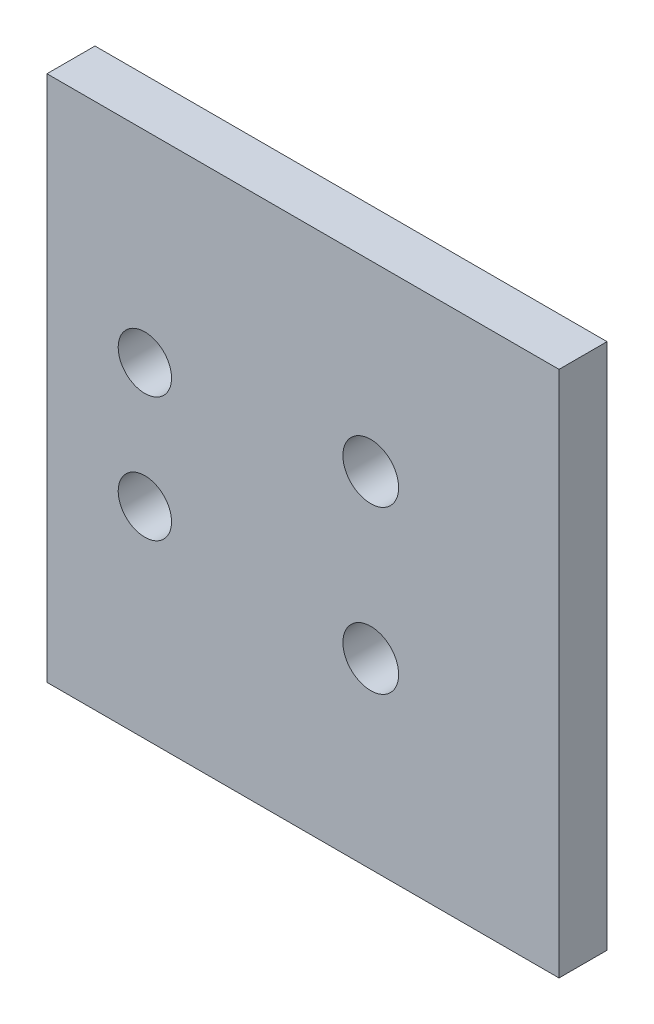
ISO-10303-21;
HEADER;
FILE_DESCRIPTION(('STEP AP214'),'2;1');
FILE_NAME('part.step','',(''),(''),'','','');
FILE_SCHEMA(('AUTOMOTIVE_DESIGN { 1 0 10303 214 1 1 1 1 }'));
ENDSEC;
DATA;
#1=APPLICATION_CONTEXT('core data for automotive mechanical design processes');
#2=APPLICATION_PROTOCOL_DEFINITION('international standard','automotive_design',2000,#1);
#3=PRODUCT_CONTEXT('',#1,'mechanical');
#4=PRODUCT('Part','Part','',(#3));
#5=PRODUCT_RELATED_PRODUCT_CATEGORY('part','',(#4));
#6=PRODUCT_DEFINITION_FORMATION('','',#4);
#7=PRODUCT_DEFINITION_CONTEXT('part definition',#1,'design');
#8=PRODUCT_DEFINITION('design','',#6,#7);
#9=PRODUCT_DEFINITION_SHAPE('','',#8);
#10=(LENGTH_UNIT() NAMED_UNIT(*) SI_UNIT(.MILLI.,.METRE.));
#11=(NAMED_UNIT(*) PLANE_ANGLE_UNIT() SI_UNIT($,.RADIAN.));
#12=(NAMED_UNIT(*) SI_UNIT($,.STERADIAN.) SOLID_ANGLE_UNIT());
#13=UNCERTAINTY_MEASURE_WITH_UNIT(LENGTH_MEASURE(1.E-05),#10,'distance_accuracy_value','');
#14=(GEOMETRIC_REPRESENTATION_CONTEXT(3) GLOBAL_UNCERTAINTY_ASSIGNED_CONTEXT((#13)) GLOBAL_UNIT_ASSIGNED_CONTEXT((#10,
#11,#12)) REPRESENTATION_CONTEXT('',''));
#15=CARTESIAN_POINT('',(0.,0.,0.));
#16=DIRECTION('',(0.,0.,1.));
#17=DIRECTION('',(1.,0.,0.));
#18=AXIS2_PLACEMENT_3D('',#15,#16,#17);
#19=CARTESIAN_POINT('',(88.138,72.39,1.6194024));
#20=DIRECTION('',(1.,0.,0.));
#21=DIRECTION('',(0.,0.,-1.));
#22=AXIS2_PLACEMENT_3D('',#19,#20,#21);
#23=PLANE('',#22);
#24=DIRECTION('',(0.,-1.,0.));
#25=VECTOR('',#24,1.);
#26=CARTESIAN_POINT('',(88.138,72.39,0.));
#27=LINE('',#26,#25);
#28=CARTESIAN_POINT('',(88.138,72.39,0.));
#29=VERTEX_POINT('',#28);
#30=CARTESIAN_POINT('',(88.138,54.61,0.));
#31=VERTEX_POINT('',#30);
#32=EDGE_CURVE('E79',#29,#31,#27,.T.);
#33=ORIENTED_EDGE('',*,*,#32,.T.);
#34=DIRECTION('',(0.,0.,-1.));
#35=VECTOR('',#34,1.);
#36=CARTESIAN_POINT('',(88.138,54.61,1.6194024));
#37=LINE('',#36,#35);
#38=CARTESIAN_POINT('',(88.138,54.61,1.6194024));
#39=VERTEX_POINT('',#38);
#40=EDGE_CURVE('E11',#39,#31,#37,.T.);
#41=ORIENTED_EDGE('',*,*,#40,.F.);
#42=DIRECTION('',(0.,-1.,0.));
#43=VECTOR('',#42,1.);
#44=CARTESIAN_POINT('',(88.138,72.39,1.6194024));
#45=LINE('',#44,#43);
#46=CARTESIAN_POINT('',(88.138,72.39,1.6194024));
#47=VERTEX_POINT('',#46);
#48=EDGE_CURVE('E67',#47,#39,#45,.T.);
#49=ORIENTED_EDGE('',*,*,#48,.F.);
#50=DIRECTION('',(0.,0.,-1.));
#51=VECTOR('',#50,1.);
#52=CARTESIAN_POINT('',(88.138,72.39,1.6194024));
#53=LINE('',#52,#51);
#54=EDGE_CURVE('E75',#47,#29,#53,.T.);
#55=ORIENTED_EDGE('',*,*,#54,.T.);
#56=EDGE_LOOP('',(#33,#41,#49,#55));
#57=FACE_BOUND('',#56,.T.);
#58=ADVANCED_FACE('F16',(#57),#23,.F.);
#59=CARTESIAN_POINT('',(88.138,54.61,1.6194024));
#60=DIRECTION('',(0.,1.,0.));
#61=DIRECTION('',(0.,0.,1.));
#62=AXIS2_PLACEMENT_3D('',#59,#60,#61);
#63=PLANE('',#62);
#64=DIRECTION('',(1.,0.,0.));
#65=VECTOR('',#64,1.);
#66=CARTESIAN_POINT('',(88.138,54.61,0.));
#67=LINE('',#66,#65);
#68=CARTESIAN_POINT('',(105.41,54.61,0.));
#69=VERTEX_POINT('',#68);
#70=EDGE_CURVE('E71',#31,#69,#67,.T.);
#71=ORIENTED_EDGE('',*,*,#70,.T.);
#72=DIRECTION('',(0.,0.,-1.));
#73=VECTOR('',#72,1.);
#74=CARTESIAN_POINT('',(105.41,54.61,1.6194024));
#75=LINE('',#74,#73);
#76=CARTESIAN_POINT('',(105.41,54.61,1.6194024));
#77=VERTEX_POINT('',#76);
#78=EDGE_CURVE('E24',#77,#69,#75,.T.);
#79=ORIENTED_EDGE('',*,*,#78,.F.);
#80=DIRECTION('',(1.,0.,0.));
#81=VECTOR('',#80,1.);
#82=CARTESIAN_POINT('',(88.138,54.61,1.6194024));
#83=LINE('',#82,#81);
#84=EDGE_CURVE('E62',#39,#77,#83,.T.);
#85=ORIENTED_EDGE('',*,*,#84,.F.);
#86=ORIENTED_EDGE('',*,*,#40,.T.);
#87=EDGE_LOOP('',(#71,#79,#85,#86));
#88=FACE_BOUND('',#87,.T.);
#89=ADVANCED_FACE('F70',(#88),#63,.F.);
#90=CARTESIAN_POINT('',(105.41,54.61,1.6194024));
#91=DIRECTION('',(-1.,0.,0.));
#92=DIRECTION('',(0.,0.,1.));
#93=AXIS2_PLACEMENT_3D('',#90,#91,#92);
#94=PLANE('',#93);
#95=DIRECTION('',(0.,1.,0.));
#96=VECTOR('',#95,1.);
#97=CARTESIAN_POINT('',(105.41,54.61,0.));
#98=LINE('',#97,#96);
#99=CARTESIAN_POINT('',(105.41,72.39,0.));
#100=VERTEX_POINT('',#99);
#101=EDGE_CURVE('E49',#69,#100,#98,.T.);
#102=ORIENTED_EDGE('',*,*,#101,.T.);
#103=DIRECTION('',(0.,0.,-1.));
#104=VECTOR('',#103,1.);
#105=CARTESIAN_POINT('',(105.41,72.39,1.6194024));
#106=LINE('',#105,#104);
#107=CARTESIAN_POINT('',(105.41,72.39,1.6194024));
#108=VERTEX_POINT('',#107);
#109=EDGE_CURVE('E72',#108,#100,#106,.T.);
#110=ORIENTED_EDGE('',*,*,#109,.F.);
#111=DIRECTION('',(0.,1.,0.));
#112=VECTOR('',#111,1.);
#113=CARTESIAN_POINT('',(105.41,54.61,1.6194024));
#114=LINE('',#113,#112);
#115=EDGE_CURVE('E65',#77,#108,#114,.T.);
#116=ORIENTED_EDGE('',*,*,#115,.F.);
#117=ORIENTED_EDGE('',*,*,#78,.T.);
#118=EDGE_LOOP('',(#102,#110,#116,#117));
#119=FACE_BOUND('',#118,.T.);
#120=ADVANCED_FACE('F73',(#119),#94,.F.);
#121=CARTESIAN_POINT('',(105.41,72.39,1.6194024));
#122=DIRECTION('',(0.,-1.,0.));
#123=DIRECTION('',(0.,0.,-1.));
#124=AXIS2_PLACEMENT_3D('',#121,#122,#123);
#125=PLANE('',#124);
#126=DIRECTION('',(-1.,0.,0.));
#127=VECTOR('',#126,1.);
#128=CARTESIAN_POINT('',(105.41,72.39,0.));
#129=LINE('',#128,#127);
#130=EDGE_CURVE('E55',#100,#29,#129,.T.);
#131=ORIENTED_EDGE('',*,*,#130,.T.);
#132=ORIENTED_EDGE('',*,*,#54,.F.);
#133=DIRECTION('',(-1.,0.,0.));
#134=VECTOR('',#133,1.);
#135=CARTESIAN_POINT('',(105.41,72.39,1.6194024));
#136=LINE('',#135,#134);
#137=EDGE_CURVE('E32',#108,#47,#136,.T.);
#138=ORIENTED_EDGE('',*,*,#137,.F.);
#139=ORIENTED_EDGE('',*,*,#109,.T.);
#140=EDGE_LOOP('',(#131,#132,#138,#139));
#141=FACE_BOUND('',#140,.T.);
#142=ADVANCED_FACE('F87',(#141),#125,.F.);
#143=CARTESIAN_POINT('',(0.,0.,1.6194024));
#144=DIRECTION('',(0.,0.,1.));
#145=DIRECTION('',(1.,0.,0.));
#146=AXIS2_PLACEMENT_3D('',#143,#144,#145);
#147=PLANE('',#146);
#148=CARTESIAN_POINT('',(91.44,61.39999912,1.6194024));
#149=DIRECTION('',(0.,0.,-1.));
#150=DIRECTION('',(-1.,0.,0.));
#151=AXIS2_PLACEMENT_3D('',#148,#149,#150);
#152=CIRCLE('',#151,0.899999469999982);
#153=CARTESIAN_POINT('',(90.54000053,61.39999912,1.6194024));
#154=VERTEX_POINT('',#153);
#155=EDGE_CURVE('E110',#154,#154,#152,.T.);
#156=ORIENTED_EDGE('',*,*,#155,.T.);
#157=EDGE_LOOP('',(#156));
#158=FACE_BOUND('',#157,.T.);
#159=CARTESIAN_POINT('',(91.44000254,65.59999834,1.6194024));
#160=DIRECTION('',(0.,0.,-1.));
#161=DIRECTION('',(-1.,0.,0.));
#162=AXIS2_PLACEMENT_3D('',#159,#160,#161);
#163=CIRCLE('',#162,0.899999469999982);
#164=CARTESIAN_POINT('',(90.54000307,65.59999834,1.6194024));
#165=VERTEX_POINT('',#164);
#166=EDGE_CURVE('E104',#165,#165,#163,.T.);
#167=ORIENTED_EDGE('',*,*,#166,.T.);
#168=EDGE_LOOP('',(#167));
#169=FACE_BOUND('',#168,.T.);
#170=CARTESIAN_POINT('',(99.06,60.7695,1.6194024));
#171=DIRECTION('',(0.,0.,-1.));
#172=DIRECTION('',(-1.,0.,0.));
#173=AXIS2_PLACEMENT_3D('',#170,#171,#172);
#174=CIRCLE('',#173,0.939999389999988);
#175=CARTESIAN_POINT('',(98.12000061,60.7695,1.6194024));
#176=VERTEX_POINT('',#175);
#177=EDGE_CURVE('E98',#176,#176,#174,.T.);
#178=ORIENTED_EDGE('',*,*,#177,.T.);
#179=EDGE_LOOP('',(#178));
#180=FACE_BOUND('',#179,.T.);
#181=CARTESIAN_POINT('',(99.06,66.2305,1.6194024));
#182=DIRECTION('',(0.,0.,-1.));
#183=DIRECTION('',(-1.,0.,0.));
#184=AXIS2_PLACEMENT_3D('',#181,#182,#183);
#185=CIRCLE('',#184,0.939999389999988);
#186=CARTESIAN_POINT('',(98.12000061,66.2305,1.6194024));
#187=VERTEX_POINT('',#186);
#188=EDGE_CURVE('E82',#187,#187,#185,.T.);
#189=ORIENTED_EDGE('',*,*,#188,.T.);
#190=EDGE_LOOP('',(#189));
#191=FACE_BOUND('',#190,.T.);
#192=ORIENTED_EDGE('',*,*,#48,.T.);
#193=ORIENTED_EDGE('',*,*,#84,.T.);
#194=ORIENTED_EDGE('',*,*,#115,.T.);
#195=ORIENTED_EDGE('',*,*,#137,.T.);
#196=EDGE_LOOP('',(#192,#193,#194,#195));
#197=FACE_BOUND('',#196,.T.);
#198=ADVANCED_FACE('F63',(#158,#169,#180,#191,#197),#147,.T.);
#199=CARTESIAN_POINT('',(0.,0.,0.));
#200=DIRECTION('',(0.,0.,1.));
#201=DIRECTION('',(1.,0.,0.));
#202=AXIS2_PLACEMENT_3D('',#199,#200,#201);
#203=PLANE('',#202);
#204=CARTESIAN_POINT('',(91.44,61.39999912,0.));
#205=DIRECTION('',(0.,0.,-1.));
#206=DIRECTION('',(-1.,0.,0.));
#207=AXIS2_PLACEMENT_3D('',#204,#205,#206);
#208=CIRCLE('',#207,0.899999469999982);
#209=CARTESIAN_POINT('',(90.54000053,61.39999912,0.));
#210=VERTEX_POINT('',#209);
#211=EDGE_CURVE('E113',#210,#210,#208,.T.);
#212=ORIENTED_EDGE('',*,*,#211,.F.);
#213=EDGE_LOOP('',(#212));
#214=FACE_BOUND('',#213,.T.);
#215=CARTESIAN_POINT('',(91.44000254,65.59999834,0.));
#216=DIRECTION('',(0.,0.,-1.));
#217=DIRECTION('',(-1.,0.,0.));
#218=AXIS2_PLACEMENT_3D('',#215,#216,#217);
#219=CIRCLE('',#218,0.899999469999982);
#220=CARTESIAN_POINT('',(90.54000307,65.59999834,0.));
#221=VERTEX_POINT('',#220);
#222=EDGE_CURVE('E107',#221,#221,#219,.T.);
#223=ORIENTED_EDGE('',*,*,#222,.F.);
#224=EDGE_LOOP('',(#223));
#225=FACE_BOUND('',#224,.T.);
#226=CARTESIAN_POINT('',(99.06,60.7695,0.));
#227=DIRECTION('',(0.,0.,-1.));
#228=DIRECTION('',(-1.,0.,0.));
#229=AXIS2_PLACEMENT_3D('',#226,#227,#228);
#230=CIRCLE('',#229,0.939999389999988);
#231=CARTESIAN_POINT('',(98.12000061,60.7695,0.));
#232=VERTEX_POINT('',#231);
#233=EDGE_CURVE('E101',#232,#232,#230,.T.);
#234=ORIENTED_EDGE('',*,*,#233,.F.);
#235=EDGE_LOOP('',(#234));
#236=FACE_BOUND('',#235,.T.);
#237=CARTESIAN_POINT('',(99.06,66.2305,0.));
#238=DIRECTION('',(0.,0.,-1.));
#239=DIRECTION('',(-1.,0.,0.));
#240=AXIS2_PLACEMENT_3D('',#237,#238,#239);
#241=CIRCLE('',#240,0.939999389999988);
#242=CARTESIAN_POINT('',(98.12000061,66.2305,0.));
#243=VERTEX_POINT('',#242);
#244=EDGE_CURVE('E95',#243,#243,#241,.T.);
#245=ORIENTED_EDGE('',*,*,#244,.F.);
#246=EDGE_LOOP('',(#245));
#247=FACE_BOUND('',#246,.T.);
#248=ORIENTED_EDGE('',*,*,#32,.F.);
#249=ORIENTED_EDGE('',*,*,#130,.F.);
#250=ORIENTED_EDGE('',*,*,#101,.F.);
#251=ORIENTED_EDGE('',*,*,#70,.F.);
#252=EDGE_LOOP('',(#248,#249,#250,#251));
#253=FACE_BOUND('',#252,.T.);
#254=ADVANCED_FACE('F90',(#214,#225,#236,#247,#253),#203,.F.);
#255=CARTESIAN_POINT('',(99.06,66.2305,0.));
#256=DIRECTION('',(0.,0.,-1.));
#257=DIRECTION('',(-1.,0.,0.));
#258=AXIS2_PLACEMENT_3D('',#255,#256,#257);
#259=CYLINDRICAL_SURFACE('',#258,0.939999389999988);
#260=ORIENTED_EDGE('',*,*,#188,.F.);
#261=EDGE_LOOP('',(#260));
#262=FACE_BOUND('',#261,.T.);
#263=ORIENTED_EDGE('',*,*,#244,.T.);
#264=EDGE_LOOP('',(#263));
#265=FACE_BOUND('',#264,.T.);
#266=ADVANCED_FACE('F121',(#262,#265),#259,.F.);
#267=CARTESIAN_POINT('',(99.06,60.7695,0.));
#268=DIRECTION('',(0.,0.,-1.));
#269=DIRECTION('',(-1.,0.,0.));
#270=AXIS2_PLACEMENT_3D('',#267,#268,#269);
#271=CYLINDRICAL_SURFACE('',#270,0.939999389999988);
#272=ORIENTED_EDGE('',*,*,#177,.F.);
#273=EDGE_LOOP('',(#272));
#274=FACE_BOUND('',#273,.T.);
#275=ORIENTED_EDGE('',*,*,#233,.T.);
#276=EDGE_LOOP('',(#275));
#277=FACE_BOUND('',#276,.T.);
#278=ADVANCED_FACE('F130',(#274,#277),#271,.F.);
#279=CARTESIAN_POINT('',(91.44000254,65.59999834,0.));
#280=DIRECTION('',(0.,0.,-1.));
#281=DIRECTION('',(-1.,0.,0.));
#282=AXIS2_PLACEMENT_3D('',#279,#280,#281);
#283=CYLINDRICAL_SURFACE('',#282,0.899999469999982);
#284=ORIENTED_EDGE('',*,*,#166,.F.);
#285=EDGE_LOOP('',(#284));
#286=FACE_BOUND('',#285,.T.);
#287=ORIENTED_EDGE('',*,*,#222,.T.);
#288=EDGE_LOOP('',(#287));
#289=FACE_BOUND('',#288,.T.);
#290=ADVANCED_FACE('F137',(#286,#289),#283,.F.);
#291=CARTESIAN_POINT('',(91.44,61.39999912,0.));
#292=DIRECTION('',(0.,0.,-1.));
#293=DIRECTION('',(-1.,0.,0.));
#294=AXIS2_PLACEMENT_3D('',#291,#292,#293);
#295=CYLINDRICAL_SURFACE('',#294,0.899999469999982);
#296=ORIENTED_EDGE('',*,*,#155,.F.);
#297=EDGE_LOOP('',(#296));
#298=FACE_BOUND('',#297,.T.);
#299=ORIENTED_EDGE('',*,*,#211,.T.);
#300=EDGE_LOOP('',(#299));
#301=FACE_BOUND('',#300,.T.);
#302=ADVANCED_FACE('F117',(#298,#301),#295,.F.);
#303=CLOSED_SHELL('',(#58,#89,#120,#142,#198,#254,#266,#278,#290,#302));
#304=MANIFOLD_SOLID_BREP('B1',#303);
#305=ADVANCED_BREP_SHAPE_REPRESENTATION('',(#18,#304),#14);
#306=SHAPE_DEFINITION_REPRESENTATION(#9,#305);
ENDSEC;
END-ISO-10303-21;
